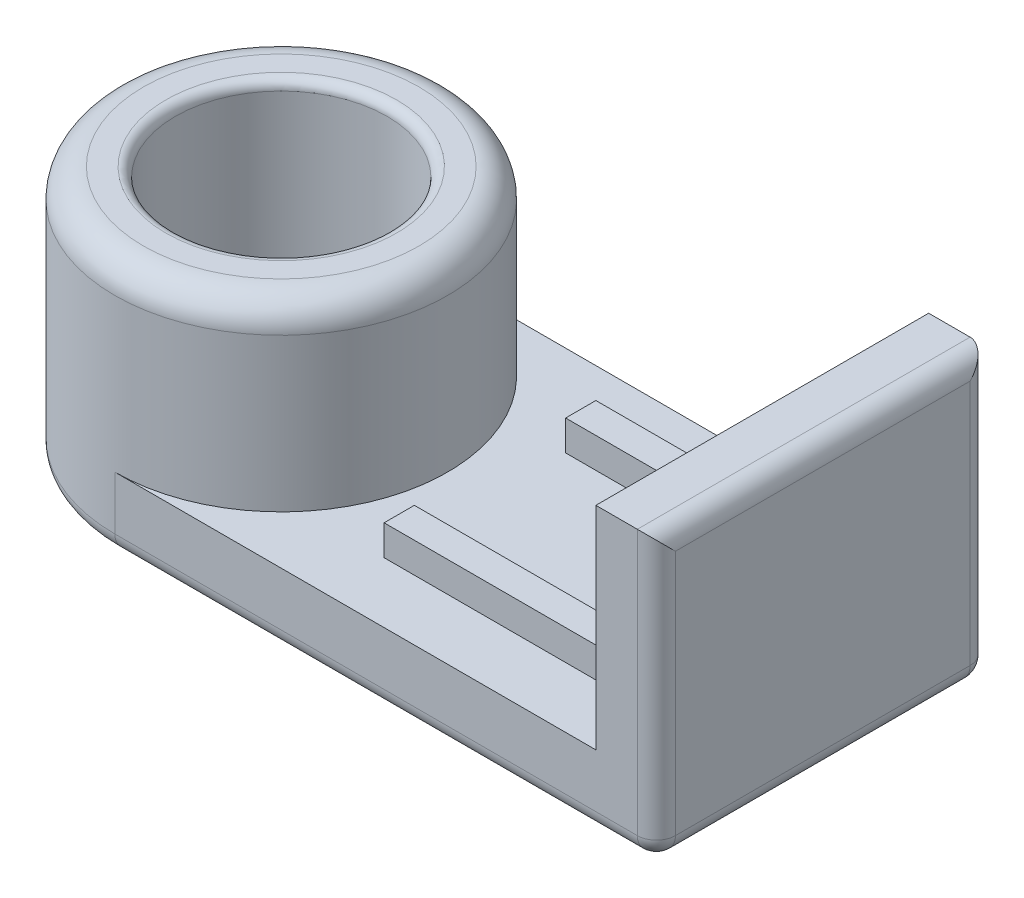
ISO-10303-21;
HEADER;
FILE_DESCRIPTION(('STEP AP214'),'2;1');
FILE_NAME('part.step','',(''),(''),'','','');
FILE_SCHEMA(('AUTOMOTIVE_DESIGN { 1 0 10303 214 1 1 1 1 }'));
ENDSEC;
DATA;
#1=APPLICATION_CONTEXT('core data for automotive mechanical design processes');
#2=APPLICATION_PROTOCOL_DEFINITION('international standard','automotive_design',2000,#1);
#3=PRODUCT_CONTEXT('',#1,'mechanical');
#4=PRODUCT('Part','Part','',(#3));
#5=PRODUCT_RELATED_PRODUCT_CATEGORY('part','',(#4));
#6=PRODUCT_DEFINITION_FORMATION('','',#4);
#7=PRODUCT_DEFINITION_CONTEXT('part definition',#1,'design');
#8=PRODUCT_DEFINITION('design','',#6,#7);
#9=PRODUCT_DEFINITION_SHAPE('','',#8);
#10=(LENGTH_UNIT() NAMED_UNIT(*) SI_UNIT(.MILLI.,.METRE.));
#11=(NAMED_UNIT(*) PLANE_ANGLE_UNIT() SI_UNIT($,.RADIAN.));
#12=(NAMED_UNIT(*) SI_UNIT($,.STERADIAN.) SOLID_ANGLE_UNIT());
#13=UNCERTAINTY_MEASURE_WITH_UNIT(LENGTH_MEASURE(1.E-05),#10,'distance_accuracy_value','');
#14=(GEOMETRIC_REPRESENTATION_CONTEXT(3) GLOBAL_UNCERTAINTY_ASSIGNED_CONTEXT((#13)) GLOBAL_UNIT_ASSIGNED_CONTEXT((#10,
#11,#12)) REPRESENTATION_CONTEXT('',''));
#15=CARTESIAN_POINT('',(0.,0.,0.));
#16=DIRECTION('',(0.,0.,1.));
#17=DIRECTION('',(1.,0.,0.));
#18=AXIS2_PLACEMENT_3D('',#15,#16,#17);
#19=CARTESIAN_POINT('',(-19.685,7.62,0.));
#20=DIRECTION('',(0.,1.,0.));
#21=DIRECTION('',(0.,0.,1.));
#22=AXIS2_PLACEMENT_3D('',#19,#20,#21);
#23=PLANE('',#22);
#24=DIRECTION('',(-1.,0.,0.));
#25=VECTOR('',#24,1.);
#26=CARTESIAN_POINT('',(27.6225,7.62,7.9375));
#27=LINE('',#26,#25);
#28=CARTESIAN_POINT('',(27.6225,7.62,7.9375));
#29=VERTEX_POINT('',#28);
#30=CARTESIAN_POINT('',(2.22249999999999,7.62,7.9375));
#31=VERTEX_POINT('',#30);
#32=EDGE_CURVE('E208',#29,#31,#27,.T.);
#33=ORIENTED_EDGE('',*,*,#32,.F.);
#34=DIRECTION('',(0.,0.,-1.));
#35=VECTOR('',#34,1.);
#36=CARTESIAN_POINT('',(27.6225,7.62,11.1125));
#37=LINE('',#36,#35);
#38=CARTESIAN_POINT('',(27.6225,7.62,11.1125));
#39=VERTEX_POINT('',#38);
#40=EDGE_CURVE('E194',#39,#29,#37,.T.);
#41=ORIENTED_EDGE('',*,*,#40,.F.);
#42=DIRECTION('',(1.,0.,0.));
#43=VECTOR('',#42,1.);
#44=CARTESIAN_POINT('',(27.6225,7.62,11.1125));
#45=LINE('',#44,#43);
#46=CARTESIAN_POINT('',(2.22249999999999,7.62,11.1125));
#47=VERTEX_POINT('',#46);
#48=EDGE_CURVE('E199',#47,#39,#45,.T.);
#49=ORIENTED_EDGE('',*,*,#48,.F.);
#50=DIRECTION('',(0.,0.,1.));
#51=VECTOR('',#50,1.);
#52=CARTESIAN_POINT('',(2.22249999999999,7.62,11.1125));
#53=LINE('',#52,#51);
#54=EDGE_CURVE('E210',#31,#47,#53,.T.);
#55=ORIENTED_EDGE('',*,*,#54,.F.);
#56=EDGE_LOOP('',(#33,#41,#49,#55));
#57=FACE_BOUND('',#56,.T.);
#58=DIRECTION('',(-1.,0.,0.));
#59=VECTOR('',#58,1.);
#60=CARTESIAN_POINT('',(27.6225,7.62,-11.1125));
#61=LINE('',#60,#59);
#62=CARTESIAN_POINT('',(27.6225,7.62,-11.1125));
#63=VERTEX_POINT('',#62);
#64=CARTESIAN_POINT('',(2.22249999999998,7.62,-11.1125));
#65=VERTEX_POINT('',#64);
#66=EDGE_CURVE('E237',#63,#65,#61,.T.);
#67=ORIENTED_EDGE('',*,*,#66,.F.);
#68=DIRECTION('',(0.,0.,-1.));
#69=VECTOR('',#68,1.);
#70=CARTESIAN_POINT('',(27.6225,7.62,-11.1125));
#71=LINE('',#70,#69);
#72=CARTESIAN_POINT('',(27.6225,7.62,-7.9375));
#73=VERTEX_POINT('',#72);
#74=EDGE_CURVE('E223',#73,#63,#71,.T.);
#75=ORIENTED_EDGE('',*,*,#74,.F.);
#76=DIRECTION('',(1.,0.,0.));
#77=VECTOR('',#76,1.);
#78=CARTESIAN_POINT('',(27.6225,7.62,-7.9375));
#79=LINE('',#78,#77);
#80=CARTESIAN_POINT('',(2.22249999999999,7.62,-7.9375));
#81=VERTEX_POINT('',#80);
#82=EDGE_CURVE('E228',#81,#73,#79,.T.);
#83=ORIENTED_EDGE('',*,*,#82,.F.);
#84=DIRECTION('',(0.,0.,1.));
#85=VECTOR('',#84,1.);
#86=CARTESIAN_POINT('',(2.22249999999998,7.62,-11.1125));
#87=LINE('',#86,#85);
#88=EDGE_CURVE('E239',#65,#81,#87,.T.);
#89=ORIENTED_EDGE('',*,*,#88,.F.);
#90=EDGE_LOOP('',(#67,#75,#83,#89));
#91=FACE_BOUND('',#90,.T.);
#92=DIRECTION('',(-1.,0.,0.));
#93=VECTOR('',#92,1.);
#94=CARTESIAN_POINT('',(-19.685,7.62,-17.4625));
#95=LINE('',#94,#93);
#96=CARTESIAN_POINT('',(30.7975,7.62,-17.4625));
#97=VERTEX_POINT('',#96);
#98=CARTESIAN_POINT('',(-19.685,7.62,-17.4625));
#99=VERTEX_POINT('',#98);
#100=EDGE_CURVE('E170',#97,#99,#95,.T.);
#101=ORIENTED_EDGE('',*,*,#100,.T.);
#102=CARTESIAN_POINT('',(-19.685,7.62,0.));
#103=DIRECTION('',(0.,1.,0.));
#104=DIRECTION('',(0.,0.,1.));
#105=AXIS2_PLACEMENT_3D('',#102,#103,#104);
#106=CIRCLE('',#105,17.4625);
#107=CARTESIAN_POINT('',(-19.685,7.62,17.4625));
#108=VERTEX_POINT('',#107);
#109=EDGE_CURVE('E175',#108,#99,#106,.T.);
#110=ORIENTED_EDGE('',*,*,#109,.F.);
#111=DIRECTION('',(1.,0.,0.));
#112=VECTOR('',#111,1.);
#113=CARTESIAN_POINT('',(-19.685,7.62,17.4625));
#114=LINE('',#113,#112);
#115=CARTESIAN_POINT('',(30.7975,7.62,17.4625));
#116=VERTEX_POINT('',#115);
#117=EDGE_CURVE('E161',#108,#116,#114,.T.);
#118=ORIENTED_EDGE('',*,*,#117,.T.);
#119=DIRECTION('',(0.,0.,1.));
#120=VECTOR('',#119,1.);
#121=CARTESIAN_POINT('',(30.7975,7.62,-17.4625));
#122=LINE('',#121,#120);
#123=EDGE_CURVE('E252',#97,#116,#122,.T.);
#124=ORIENTED_EDGE('',*,*,#123,.F.);
#125=EDGE_LOOP('',(#101,#110,#118,#124));
#126=FACE_BOUND('',#125,.T.);
#127=ADVANCED_FACE('F34',(#57,#91,#126),#23,.T.);
#128=CARTESIAN_POINT('',(-19.685,7.62,17.4625));
#129=DIRECTION('',(0.,0.,-1.));
#130=DIRECTION('',(-1.,0.,0.));
#131=AXIS2_PLACEMENT_3D('',#128,#129,#130);
#132=PLANE('',#131);
#133=DIRECTION('',(0.,-1.,0.));
#134=VECTOR('',#133,1.);
#135=CARTESIAN_POINT('',(-19.685,7.62,17.4625));
#136=LINE('',#135,#134);
#137=CARTESIAN_POINT('',(-19.685,2.,17.4625));
#138=VERTEX_POINT('',#137);
#139=EDGE_CURVE('E163',#108,#138,#136,.T.);
#140=ORIENTED_EDGE('',*,*,#139,.T.);
#141=DIRECTION('',(1.,0.,0.));
#142=VECTOR('',#141,1.);
#143=CARTESIAN_POINT('',(-19.685,2.,17.4625));
#144=LINE('',#143,#142);
#145=CARTESIAN_POINT('',(35.1475,2.,17.4625));
#146=VERTEX_POINT('',#145);
#147=EDGE_CURVE('E302',#138,#146,#144,.T.);
#148=ORIENTED_EDGE('',*,*,#147,.T.);
#149=DIRECTION('',(0.,-1.,0.));
#150=VECTOR('',#149,1.);
#151=CARTESIAN_POINT('',(35.1475,7.62,17.4625));
#152=LINE('',#151,#150);
#153=CARTESIAN_POINT('',(35.1475,29.845,17.4625));
#154=VERTEX_POINT('',#153);
#155=EDGE_CURVE('E274',#146,#154,#152,.F.);
#156=ORIENTED_EDGE('',*,*,#155,.T.);
#157=DIRECTION('',(1.,0.,0.));
#158=VECTOR('',#157,1.);
#159=CARTESIAN_POINT('',(30.7975,29.845,17.4625));
#160=LINE('',#159,#158);
#161=CARTESIAN_POINT('',(30.7975,29.845,17.4625));
#162=VERTEX_POINT('',#161);
#163=EDGE_CURVE('E188',#162,#154,#160,.T.);
#164=ORIENTED_EDGE('',*,*,#163,.F.);
#165=DIRECTION('',(0.,-1.,0.));
#166=VECTOR('',#165,1.);
#167=CARTESIAN_POINT('',(30.7975,20.32,17.4625));
#168=LINE('',#167,#166);
#169=EDGE_CURVE('E166',#162,#116,#168,.T.);
#170=ORIENTED_EDGE('',*,*,#169,.T.);
#171=ORIENTED_EDGE('',*,*,#117,.F.);
#172=EDGE_LOOP('',(#140,#148,#156,#164,#170,#171));
#173=FACE_BOUND('',#172,.T.);
#174=ADVANCED_FACE('F162',(#173),#132,.F.);
#175=CARTESIAN_POINT('',(37.1475,7.62,17.4625));
#176=DIRECTION('',(-1.,0.,0.));
#177=DIRECTION('',(0.,0.,1.));
#178=AXIS2_PLACEMENT_3D('',#175,#176,#177);
#179=PLANE('',#178);
#180=DIRECTION('',(0.,-1.,0.));
#181=VECTOR('',#180,1.);
#182=CARTESIAN_POINT('',(37.1475,7.62,15.4625));
#183=LINE('',#182,#181);
#184=CARTESIAN_POINT('',(37.1475,27.845,15.4625));
#185=VERTEX_POINT('',#184);
#186=CARTESIAN_POINT('',(37.1475,2.,15.4625));
#187=VERTEX_POINT('',#186);
#188=EDGE_CURVE('E271',#185,#187,#183,.T.);
#189=ORIENTED_EDGE('',*,*,#188,.T.);
#190=DIRECTION('',(0.,0.,-1.));
#191=VECTOR('',#190,1.);
#192=CARTESIAN_POINT('',(37.1475,2.,17.4625));
#193=LINE('',#192,#191);
#194=CARTESIAN_POINT('',(37.1475,2.,-15.4625));
#195=VERTEX_POINT('',#194);
#196=EDGE_CURVE('E289',#187,#195,#193,.T.);
#197=ORIENTED_EDGE('',*,*,#196,.T.);
#198=DIRECTION('',(0.,-1.,0.));
#199=VECTOR('',#198,1.);
#200=CARTESIAN_POINT('',(37.1475,7.62,-15.4625));
#201=LINE('',#200,#199);
#202=CARTESIAN_POINT('',(37.1475,27.845,-15.4625));
#203=VERTEX_POINT('',#202);
#204=EDGE_CURVE('E269',#195,#203,#201,.F.);
#205=ORIENTED_EDGE('',*,*,#204,.T.);
#206=DIRECTION('',(0.,0.,-1.));
#207=VECTOR('',#206,1.);
#208=CARTESIAN_POINT('',(37.1475,27.845,17.4625));
#209=LINE('',#208,#207);
#210=EDGE_CURVE('E267',#203,#185,#209,.F.);
#211=ORIENTED_EDGE('',*,*,#210,.T.);
#212=EDGE_LOOP('',(#189,#197,#205,#211));
#213=FACE_BOUND('',#212,.T.);
#214=ADVANCED_FACE('F349',(#213),#179,.F.);
#215=CARTESIAN_POINT('',(-19.685,7.62,-17.4625));
#216=DIRECTION('',(0.,0.,1.));
#217=DIRECTION('',(1.,0.,0.));
#218=AXIS2_PLACEMENT_3D('',#215,#216,#217);
#219=PLANE('',#218);
#220=DIRECTION('',(0.,-1.,0.));
#221=VECTOR('',#220,1.);
#222=CARTESIAN_POINT('',(35.1475,7.62,-17.4625));
#223=LINE('',#222,#221);
#224=CARTESIAN_POINT('',(35.1475,29.845,-17.4625));
#225=VERTEX_POINT('',#224);
#226=CARTESIAN_POINT('',(35.1475,2.,-17.4625));
#227=VERTEX_POINT('',#226);
#228=EDGE_CURVE('E276',#225,#227,#223,.T.);
#229=ORIENTED_EDGE('',*,*,#228,.T.);
#230=DIRECTION('',(-1.,0.,0.));
#231=VECTOR('',#230,1.);
#232=CARTESIAN_POINT('',(-19.685,2.,-17.4625));
#233=LINE('',#232,#231);
#234=CARTESIAN_POINT('',(-19.685,2.,-17.4625));
#235=VERTEX_POINT('',#234);
#236=EDGE_CURVE('E49',#227,#235,#233,.T.);
#237=ORIENTED_EDGE('',*,*,#236,.T.);
#238=DIRECTION('',(0.,-1.,0.));
#239=VECTOR('',#238,1.);
#240=CARTESIAN_POINT('',(-19.685,7.62,-17.4625));
#241=LINE('',#240,#239);
#242=EDGE_CURVE('E176',#99,#235,#241,.T.);
#243=ORIENTED_EDGE('',*,*,#242,.F.);
#244=ORIENTED_EDGE('',*,*,#100,.F.);
#245=DIRECTION('',(0.,-1.,0.));
#246=VECTOR('',#245,1.);
#247=CARTESIAN_POINT('',(30.7975,20.32,-17.4625));
#248=LINE('',#247,#246);
#249=CARTESIAN_POINT('',(30.7975,29.845,-17.4625));
#250=VERTEX_POINT('',#249);
#251=EDGE_CURVE('E171',#250,#97,#248,.T.);
#252=ORIENTED_EDGE('',*,*,#251,.F.);
#253=DIRECTION('',(-1.,0.,0.));
#254=VECTOR('',#253,1.);
#255=CARTESIAN_POINT('',(30.7975,29.845,-17.4625));
#256=LINE('',#255,#254);
#257=EDGE_CURVE('E192',#225,#250,#256,.T.);
#258=ORIENTED_EDGE('',*,*,#257,.F.);
#259=EDGE_LOOP('',(#229,#237,#243,#244,#252,#258));
#260=FACE_BOUND('',#259,.T.);
#261=ADVANCED_FACE('F363',(#260),#219,.F.);
#262=CARTESIAN_POINT('',(-19.685,7.62,0.));
#263=DIRECTION('',(0.,-1.,0.));
#264=DIRECTION('',(0.,0.,-1.));
#265=AXIS2_PLACEMENT_3D('',#262,#263,#264);
#266=CYLINDRICAL_SURFACE('',#265,17.4625);
#267=CARTESIAN_POINT('',(-19.685,23.67,0.));
#268=DIRECTION('',(0.,1.,0.));
#269=DIRECTION('',(0.,0.,1.));
#270=AXIS2_PLACEMENT_3D('',#267,#268,#269);
#271=CIRCLE('',#270,17.4625);
#272=CARTESIAN_POINT('',(-19.685,23.67,17.4625));
#273=VERTEX_POINT('',#272);
#274=EDGE_CURVE('E11',#273,#273,#271,.F.);
#275=ORIENTED_EDGE('',*,*,#274,.T.);
#276=EDGE_LOOP('',(#275));
#277=FACE_BOUND('',#276,.T.);
#278=ORIENTED_EDGE('',*,*,#242,.T.);
#279=CARTESIAN_POINT('',(-19.685,2.,0.));
#280=DIRECTION('',(0.,1.,0.));
#281=DIRECTION('',(0.,0.,1.));
#282=AXIS2_PLACEMENT_3D('',#279,#280,#281);
#283=CIRCLE('',#282,17.4625);
#284=EDGE_CURVE('E56',#235,#138,#283,.T.);
#285=ORIENTED_EDGE('',*,*,#284,.T.);
#286=ORIENTED_EDGE('',*,*,#139,.F.);
#287=ORIENTED_EDGE('',*,*,#109,.T.);
#288=EDGE_LOOP('',(#278,#285,#286,#287));
#289=FACE_BOUND('',#288,.T.);
#290=ADVANCED_FACE('F174',(#277,#289),#266,.T.);
#291=CARTESIAN_POINT('',(-19.685,0.,0.));
#292=DIRECTION('',(0.,1.,0.));
#293=DIRECTION('',(0.,0.,1.));
#294=AXIS2_PLACEMENT_3D('',#291,#292,#293);
#295=PLANE('',#294);
#296=CARTESIAN_POINT('',(-19.685,0.,0.));
#297=DIRECTION('',(0.,1.,0.));
#298=DIRECTION('',(0.,0.,1.));
#299=AXIS2_PLACEMENT_3D('',#296,#297,#298);
#300=CIRCLE('',#299,12.1125);
#301=CARTESIAN_POINT('',(-19.685,0.,12.1125));
#302=VERTEX_POINT('',#301);
#303=EDGE_CURVE('E326',#302,#302,#300,.T.);
#304=ORIENTED_EDGE('',*,*,#303,.T.);
#305=EDGE_LOOP('',(#304));
#306=FACE_BOUND('',#305,.T.);
#307=DIRECTION('',(-1.,0.,0.));
#308=VECTOR('',#307,1.);
#309=CARTESIAN_POINT('',(-19.685,0.,-15.4625));
#310=LINE('',#309,#308);
#311=CARTESIAN_POINT('',(-19.685,0.,-15.4625));
#312=VERTEX_POINT('',#311);
#313=CARTESIAN_POINT('',(35.1475,0.,-15.4625));
#314=VERTEX_POINT('',#313);
#315=EDGE_CURVE('E291',#312,#314,#310,.F.);
#316=ORIENTED_EDGE('',*,*,#315,.T.);
#317=DIRECTION('',(0.,0.,-1.));
#318=VECTOR('',#317,1.);
#319=CARTESIAN_POINT('',(35.1475,0.,0.));
#320=LINE('',#319,#318);
#321=CARTESIAN_POINT('',(35.1475,0.,15.4625));
#322=VERTEX_POINT('',#321);
#323=EDGE_CURVE('E297',#314,#322,#320,.F.);
#324=ORIENTED_EDGE('',*,*,#323,.T.);
#325=DIRECTION('',(1.,0.,0.));
#326=VECTOR('',#325,1.);
#327=CARTESIAN_POINT('',(-19.685,0.,15.4625));
#328=LINE('',#327,#326);
#329=CARTESIAN_POINT('',(-19.685,0.,15.4625));
#330=VERTEX_POINT('',#329);
#331=EDGE_CURVE('E295',#322,#330,#328,.F.);
#332=ORIENTED_EDGE('',*,*,#331,.T.);
#333=CARTESIAN_POINT('',(-19.685,0.,0.));
#334=DIRECTION('',(0.,1.,0.));
#335=DIRECTION('',(0.,0.,1.));
#336=AXIS2_PLACEMENT_3D('',#333,#334,#335);
#337=CIRCLE('',#336,15.4625);
#338=EDGE_CURVE('E293',#330,#312,#337,.F.);
#339=ORIENTED_EDGE('',*,*,#338,.T.);
#340=EDGE_LOOP('',(#316,#324,#332,#339));
#341=FACE_BOUND('',#340,.T.);
#342=ADVANCED_FACE('F357',(#306,#341),#295,.F.);
#343=CARTESIAN_POINT('',(30.7975,20.32,-17.4625));
#344=DIRECTION('',(1.,0.,0.));
#345=DIRECTION('',(0.,0.,-1.));
#346=AXIS2_PLACEMENT_3D('',#343,#344,#345);
#347=PLANE('',#346);
#348=ORIENTED_EDGE('',*,*,#123,.T.);
#349=ORIENTED_EDGE('',*,*,#169,.F.);
#350=DIRECTION('',(0.,0.,1.));
#351=VECTOR('',#350,1.);
#352=CARTESIAN_POINT('',(30.7975,29.845,-17.4625));
#353=LINE('',#352,#351);
#354=EDGE_CURVE('E185',#250,#162,#353,.T.);
#355=ORIENTED_EDGE('',*,*,#354,.F.);
#356=ORIENTED_EDGE('',*,*,#251,.T.);
#357=EDGE_LOOP('',(#348,#349,#355,#356));
#358=FACE_BOUND('',#357,.T.);
#359=ADVANCED_FACE('F355',(#358),#347,.F.);
#360=CARTESIAN_POINT('',(-19.685,-5.08,0.));
#361=DIRECTION('',(0.,1.,0.));
#362=DIRECTION('',(0.,0.,1.));
#363=AXIS2_PLACEMENT_3D('',#360,#361,#362);
#364=CYLINDRICAL_SURFACE('',#363,11.1125);
#365=CARTESIAN_POINT('',(-19.685,25.67,0.));
#366=DIRECTION('',(0.,1.,0.));
#367=DIRECTION('',(0.,0.,1.));
#368=AXIS2_PLACEMENT_3D('',#365,#366,#367);
#369=CIRCLE('',#368,11.1125);
#370=CARTESIAN_POINT('',(-19.685,25.67,11.1125));
#371=VERTEX_POINT('',#370);
#372=EDGE_CURVE('E320',#371,#371,#369,.T.);
#373=ORIENTED_EDGE('',*,*,#372,.T.);
#374=EDGE_LOOP('',(#373));
#375=FACE_BOUND('',#374,.T.);
#376=CARTESIAN_POINT('',(-19.685,1.,0.));
#377=DIRECTION('',(0.,1.,0.));
#378=DIRECTION('',(0.,0.,1.));
#379=AXIS2_PLACEMENT_3D('',#376,#377,#378);
#380=CIRCLE('',#379,11.1125);
#381=CARTESIAN_POINT('',(-19.685,1.,11.1125));
#382=VERTEX_POINT('',#381);
#383=EDGE_CURVE('E305',#382,#382,#380,.F.);
#384=ORIENTED_EDGE('',*,*,#383,.T.);
#385=EDGE_LOOP('',(#384));
#386=FACE_BOUND('',#385,.T.);
#387=ADVANCED_FACE('F417',(#375,#386),#364,.F.);
#388=CARTESIAN_POINT('',(27.6225,10.795,-11.1125));
#389=DIRECTION('',(-1.,0.,0.));
#390=DIRECTION('',(0.,0.,1.));
#391=AXIS2_PLACEMENT_3D('',#388,#389,#390);
#392=PLANE('',#391);
#393=ORIENTED_EDGE('',*,*,#74,.T.);
#394=DIRECTION('',(0.,-1.,0.));
#395=VECTOR('',#394,1.);
#396=CARTESIAN_POINT('',(27.6225,10.795,-11.1125));
#397=LINE('',#396,#395);
#398=CARTESIAN_POINT('',(27.6225,10.795,-11.1125));
#399=VERTEX_POINT('',#398);
#400=EDGE_CURVE('E250',#399,#63,#397,.T.);
#401=ORIENTED_EDGE('',*,*,#400,.F.);
#402=DIRECTION('',(0.,0.,-1.));
#403=VECTOR('',#402,1.);
#404=CARTESIAN_POINT('',(27.6225,10.795,-11.1125));
#405=LINE('',#404,#403);
#406=CARTESIAN_POINT('',(27.6225,10.795,-7.9375));
#407=VERTEX_POINT('',#406);
#408=EDGE_CURVE('E224',#407,#399,#405,.T.);
#409=ORIENTED_EDGE('',*,*,#408,.F.);
#410=DIRECTION('',(0.,-1.,0.));
#411=VECTOR('',#410,1.);
#412=CARTESIAN_POINT('',(27.6225,10.795,-7.9375));
#413=LINE('',#412,#411);
#414=EDGE_CURVE('E234',#407,#73,#413,.T.);
#415=ORIENTED_EDGE('',*,*,#414,.T.);
#416=EDGE_LOOP('',(#393,#401,#409,#415));
#417=FACE_BOUND('',#416,.T.);
#418=ADVANCED_FACE('F420',(#417),#392,.F.);
#419=CARTESIAN_POINT('',(27.6225,10.795,-11.1125));
#420=DIRECTION('',(0.,0.,1.));
#421=DIRECTION('',(1.,0.,0.));
#422=AXIS2_PLACEMENT_3D('',#419,#420,#421);
#423=PLANE('',#422);
#424=ORIENTED_EDGE('',*,*,#66,.T.);
#425=DIRECTION('',(0.,-1.,0.));
#426=VECTOR('',#425,1.);
#427=CARTESIAN_POINT('',(2.22249999999998,10.795,-11.1125));
#428=LINE('',#427,#426);
#429=CARTESIAN_POINT('',(2.22249999999998,10.795,-11.1125));
#430=VERTEX_POINT('',#429);
#431=EDGE_CURVE('E247',#430,#65,#428,.T.);
#432=ORIENTED_EDGE('',*,*,#431,.F.);
#433=DIRECTION('',(-1.,0.,0.));
#434=VECTOR('',#433,1.);
#435=CARTESIAN_POINT('',(27.6225,10.795,-11.1125));
#436=LINE('',#435,#434);
#437=EDGE_CURVE('E227',#399,#430,#436,.T.);
#438=ORIENTED_EDGE('',*,*,#437,.F.);
#439=ORIENTED_EDGE('',*,*,#400,.T.);
#440=EDGE_LOOP('',(#424,#432,#438,#439));
#441=FACE_BOUND('',#440,.T.);
#442=ADVANCED_FACE('F470',(#441),#423,.F.);
#443=CARTESIAN_POINT('',(2.22249999999998,10.795,-11.1125));
#444=DIRECTION('',(1.,0.,0.));
#445=DIRECTION('',(0.,0.,-1.));
#446=AXIS2_PLACEMENT_3D('',#443,#444,#445);
#447=PLANE('',#446);
#448=ORIENTED_EDGE('',*,*,#88,.T.);
#449=DIRECTION('',(0.,-1.,0.));
#450=VECTOR('',#449,1.);
#451=CARTESIAN_POINT('',(2.22249999999999,10.795,-7.9375));
#452=LINE('',#451,#450);
#453=CARTESIAN_POINT('',(2.22249999999999,10.795,-7.9375));
#454=VERTEX_POINT('',#453);
#455=EDGE_CURVE('E245',#454,#81,#452,.T.);
#456=ORIENTED_EDGE('',*,*,#455,.F.);
#457=DIRECTION('',(0.,0.,1.));
#458=VECTOR('',#457,1.);
#459=CARTESIAN_POINT('',(2.22249999999998,10.795,-11.1125));
#460=LINE('',#459,#458);
#461=EDGE_CURVE('E230',#430,#454,#460,.T.);
#462=ORIENTED_EDGE('',*,*,#461,.F.);
#463=ORIENTED_EDGE('',*,*,#431,.T.);
#464=EDGE_LOOP('',(#448,#456,#462,#463));
#465=FACE_BOUND('',#464,.T.);
#466=ADVANCED_FACE('F478',(#465),#447,.F.);
#467=CARTESIAN_POINT('',(27.6225,10.795,-7.9375));
#468=DIRECTION('',(0.,0.,-1.));
#469=DIRECTION('',(-1.,0.,0.));
#470=AXIS2_PLACEMENT_3D('',#467,#468,#469);
#471=PLANE('',#470);
#472=ORIENTED_EDGE('',*,*,#82,.T.);
#473=ORIENTED_EDGE('',*,*,#414,.F.);
#474=DIRECTION('',(1.,0.,0.));
#475=VECTOR('',#474,1.);
#476=CARTESIAN_POINT('',(27.6225,10.795,-7.9375));
#477=LINE('',#476,#475);
#478=EDGE_CURVE('E232',#454,#407,#477,.T.);
#479=ORIENTED_EDGE('',*,*,#478,.F.);
#480=ORIENTED_EDGE('',*,*,#455,.T.);
#481=EDGE_LOOP('',(#472,#473,#479,#480));
#482=FACE_BOUND('',#481,.T.);
#483=ADVANCED_FACE('F486',(#482),#471,.F.);
#484=CARTESIAN_POINT('',(0.,10.795,0.));
#485=DIRECTION('',(0.,-1.,0.));
#486=DIRECTION('',(0.,0.,-1.));
#487=AXIS2_PLACEMENT_3D('',#484,#485,#486);
#488=PLANE('',#487);
#489=ORIENTED_EDGE('',*,*,#408,.T.);
#490=ORIENTED_EDGE('',*,*,#437,.T.);
#491=ORIENTED_EDGE('',*,*,#461,.T.);
#492=ORIENTED_EDGE('',*,*,#478,.T.);
#493=EDGE_LOOP('',(#489,#490,#491,#492));
#494=FACE_BOUND('',#493,.T.);
#495=ADVANCED_FACE('F494',(#494),#488,.F.);
#496=CARTESIAN_POINT('',(27.6225,10.795,11.1125));
#497=DIRECTION('',(-1.,0.,0.));
#498=DIRECTION('',(0.,0.,1.));
#499=AXIS2_PLACEMENT_3D('',#496,#497,#498);
#500=PLANE('',#499);
#501=ORIENTED_EDGE('',*,*,#40,.T.);
#502=DIRECTION('',(0.,-1.,0.));
#503=VECTOR('',#502,1.);
#504=CARTESIAN_POINT('',(27.6225,10.795,7.9375));
#505=LINE('',#504,#503);
#506=CARTESIAN_POINT('',(27.6225,10.795,7.9375));
#507=VERTEX_POINT('',#506);
#508=EDGE_CURVE('E221',#507,#29,#505,.T.);
#509=ORIENTED_EDGE('',*,*,#508,.F.);
#510=DIRECTION('',(0.,0.,-1.));
#511=VECTOR('',#510,1.);
#512=CARTESIAN_POINT('',(27.6225,10.795,11.1125));
#513=LINE('',#512,#511);
#514=CARTESIAN_POINT('',(27.6225,10.795,11.1125));
#515=VERTEX_POINT('',#514);
#516=EDGE_CURVE('E195',#515,#507,#513,.T.);
#517=ORIENTED_EDGE('',*,*,#516,.F.);
#518=DIRECTION('',(0.,-1.,0.));
#519=VECTOR('',#518,1.);
#520=CARTESIAN_POINT('',(27.6225,10.795,11.1125));
#521=LINE('',#520,#519);
#522=EDGE_CURVE('E205',#515,#39,#521,.T.);
#523=ORIENTED_EDGE('',*,*,#522,.T.);
#524=EDGE_LOOP('',(#501,#509,#517,#523));
#525=FACE_BOUND('',#524,.T.);
#526=ADVANCED_FACE('F502',(#525),#500,.F.);
#527=CARTESIAN_POINT('',(27.6225,10.795,7.9375));
#528=DIRECTION('',(0.,0.,1.));
#529=DIRECTION('',(1.,0.,0.));
#530=AXIS2_PLACEMENT_3D('',#527,#528,#529);
#531=PLANE('',#530);
#532=ORIENTED_EDGE('',*,*,#32,.T.);
#533=DIRECTION('',(0.,-1.,0.));
#534=VECTOR('',#533,1.);
#535=CARTESIAN_POINT('',(2.22249999999999,10.795,7.9375));
#536=LINE('',#535,#534);
#537=CARTESIAN_POINT('',(2.22249999999999,10.795,7.9375));
#538=VERTEX_POINT('',#537);
#539=EDGE_CURVE('E218',#538,#31,#536,.T.);
#540=ORIENTED_EDGE('',*,*,#539,.F.);
#541=DIRECTION('',(-1.,0.,0.));
#542=VECTOR('',#541,1.);
#543=CARTESIAN_POINT('',(27.6225,10.795,7.9375));
#544=LINE('',#543,#542);
#545=EDGE_CURVE('E198',#507,#538,#544,.T.);
#546=ORIENTED_EDGE('',*,*,#545,.F.);
#547=ORIENTED_EDGE('',*,*,#508,.T.);
#548=EDGE_LOOP('',(#532,#540,#546,#547));
#549=FACE_BOUND('',#548,.T.);
#550=ADVANCED_FACE('F510',(#549),#531,.F.);
#551=CARTESIAN_POINT('',(2.22249999999999,10.795,11.1125));
#552=DIRECTION('',(1.,0.,0.));
#553=DIRECTION('',(0.,0.,-1.));
#554=AXIS2_PLACEMENT_3D('',#551,#552,#553);
#555=PLANE('',#554);
#556=ORIENTED_EDGE('',*,*,#54,.T.);
#557=DIRECTION('',(0.,-1.,0.));
#558=VECTOR('',#557,1.);
#559=CARTESIAN_POINT('',(2.22249999999999,10.795,11.1125));
#560=LINE('',#559,#558);
#561=CARTESIAN_POINT('',(2.22249999999999,10.795,11.1125));
#562=VERTEX_POINT('',#561);
#563=EDGE_CURVE('E216',#562,#47,#560,.T.);
#564=ORIENTED_EDGE('',*,*,#563,.F.);
#565=DIRECTION('',(0.,0.,1.));
#566=VECTOR('',#565,1.);
#567=CARTESIAN_POINT('',(2.22249999999999,10.795,11.1125));
#568=LINE('',#567,#566);
#569=EDGE_CURVE('E201',#538,#562,#568,.T.);
#570=ORIENTED_EDGE('',*,*,#569,.F.);
#571=ORIENTED_EDGE('',*,*,#539,.T.);
#572=EDGE_LOOP('',(#556,#564,#570,#571));
#573=FACE_BOUND('',#572,.T.);
#574=ADVANCED_FACE('F518',(#573),#555,.F.);
#575=CARTESIAN_POINT('',(27.6225,10.795,11.1125));
#576=DIRECTION('',(0.,0.,-1.));
#577=DIRECTION('',(-1.,0.,0.));
#578=AXIS2_PLACEMENT_3D('',#575,#576,#577);
#579=PLANE('',#578);
#580=ORIENTED_EDGE('',*,*,#48,.T.);
#581=ORIENTED_EDGE('',*,*,#522,.F.);
#582=DIRECTION('',(1.,0.,0.));
#583=VECTOR('',#582,1.);
#584=CARTESIAN_POINT('',(27.6225,10.795,11.1125));
#585=LINE('',#584,#583);
#586=EDGE_CURVE('E203',#562,#515,#585,.T.);
#587=ORIENTED_EDGE('',*,*,#586,.F.);
#588=ORIENTED_EDGE('',*,*,#563,.T.);
#589=EDGE_LOOP('',(#580,#581,#587,#588));
#590=FACE_BOUND('',#589,.T.);
#591=ADVANCED_FACE('F526',(#590),#579,.F.);
#592=CARTESIAN_POINT('',(0.,10.795,0.));
#593=DIRECTION('',(0.,1.,0.));
#594=DIRECTION('',(0.,0.,1.));
#595=AXIS2_PLACEMENT_3D('',#592,#593,#594);
#596=PLANE('',#595);
#597=ORIENTED_EDGE('',*,*,#516,.T.);
#598=ORIENTED_EDGE('',*,*,#545,.T.);
#599=ORIENTED_EDGE('',*,*,#569,.T.);
#600=ORIENTED_EDGE('',*,*,#586,.T.);
#601=EDGE_LOOP('',(#597,#598,#599,#600));
#602=FACE_BOUND('',#601,.T.);
#603=ADVANCED_FACE('F534',(#602),#596,.T.);
#604=CARTESIAN_POINT('',(0.,29.845,0.));
#605=DIRECTION('',(0.,1.,0.));
#606=DIRECTION('',(0.,0.,1.));
#607=AXIS2_PLACEMENT_3D('',#604,#605,#606);
#608=PLANE('',#607);
#609=ORIENTED_EDGE('',*,*,#163,.T.);
#610=DIRECTION('',(0.,0.,-1.));
#611=VECTOR('',#610,1.);
#612=CARTESIAN_POINT('',(35.1475,29.845,-17.4625));
#613=LINE('',#612,#611);
#614=EDGE_CURVE('E278',#154,#225,#613,.T.);
#615=ORIENTED_EDGE('',*,*,#614,.T.);
#616=ORIENTED_EDGE('',*,*,#257,.T.);
#617=ORIENTED_EDGE('',*,*,#354,.T.);
#618=EDGE_LOOP('',(#609,#615,#616,#617));
#619=FACE_BOUND('',#618,.T.);
#620=ADVANCED_FACE('F382',(#619),#608,.T.);
#621=CARTESIAN_POINT('',(35.1475,7.62,-15.4625));
#622=DIRECTION('',(0.,-1.,0.));
#623=DIRECTION('',(0.,0.,-1.));
#624=AXIS2_PLACEMENT_3D('',#621,#622,#623);
#625=CYLINDRICAL_SURFACE('',#624,2.);
#626=ORIENTED_EDGE('',*,*,#204,.F.);
#627=CARTESIAN_POINT('',(35.1475,2.,-15.4625));
#628=DIRECTION('',(0.,-1.,0.));
#629=DIRECTION('',(0.,0.,-1.));
#630=AXIS2_PLACEMENT_3D('',#627,#628,#629);
#631=CIRCLE('',#630,2.);
#632=EDGE_CURVE('E280',#195,#227,#631,.F.);
#633=ORIENTED_EDGE('',*,*,#632,.T.);
#634=ORIENTED_EDGE('',*,*,#228,.F.);
#635=CARTESIAN_POINT('',(35.1475,27.845,-15.4625));
#636=DIRECTION('',(0.,0.707106781186547,0.707106781186547));
#637=DIRECTION('',(0.,-0.707106781186547,0.707106781186547));
#638=AXIS2_PLACEMENT_3D('',#635,#636,#637);
#639=ELLIPSE('',#638,2.82842712474619,2.);
#640=EDGE_CURVE('E189',#203,#225,#639,.T.);
#641=ORIENTED_EDGE('',*,*,#640,.F.);
#642=EDGE_LOOP('',(#626,#633,#634,#641));
#643=FACE_BOUND('',#642,.T.);
#644=ADVANCED_FACE('F378',(#643),#625,.T.);
#645=CARTESIAN_POINT('',(35.1475,27.845,0.));
#646=DIRECTION('',(0.,0.,1.));
#647=DIRECTION('',(1.,0.,0.));
#648=AXIS2_PLACEMENT_3D('',#645,#646,#647);
#649=CYLINDRICAL_SURFACE('',#648,2.);
#650=ORIENTED_EDGE('',*,*,#640,.T.);
#651=ORIENTED_EDGE('',*,*,#614,.F.);
#652=CARTESIAN_POINT('',(35.1475,27.845,15.4625));
#653=DIRECTION('',(0.,-0.707106781186547,0.707106781186547));
#654=DIRECTION('',(0.,0.707106781186547,0.707106781186547));
#655=AXIS2_PLACEMENT_3D('',#652,#653,#654);
#656=ELLIPSE('',#655,2.82842712474619,2.);
#657=EDGE_CURVE('E281',#185,#154,#656,.T.);
#658=ORIENTED_EDGE('',*,*,#657,.F.);
#659=ORIENTED_EDGE('',*,*,#210,.F.);
#660=EDGE_LOOP('',(#650,#651,#658,#659));
#661=FACE_BOUND('',#660,.T.);
#662=ADVANCED_FACE('F374',(#661),#649,.T.);
#663=CARTESIAN_POINT('',(35.1475,7.62,15.4625));
#664=DIRECTION('',(0.,-1.,0.));
#665=DIRECTION('',(0.,0.,-1.));
#666=AXIS2_PLACEMENT_3D('',#663,#664,#665);
#667=CYLINDRICAL_SURFACE('',#666,2.);
#668=ORIENTED_EDGE('',*,*,#155,.F.);
#669=CARTESIAN_POINT('',(35.1475,2.,15.4625));
#670=DIRECTION('',(0.,-1.,0.));
#671=DIRECTION('',(0.,0.,-1.));
#672=AXIS2_PLACEMENT_3D('',#669,#670,#671);
#673=CIRCLE('',#672,2.);
#674=EDGE_CURVE('E300',#146,#187,#673,.F.);
#675=ORIENTED_EDGE('',*,*,#674,.T.);
#676=ORIENTED_EDGE('',*,*,#188,.F.);
#677=ORIENTED_EDGE('',*,*,#657,.T.);
#678=EDGE_LOOP('',(#668,#675,#676,#677));
#679=FACE_BOUND('',#678,.T.);
#680=ADVANCED_FACE('F370',(#679),#667,.T.);
#681=CARTESIAN_POINT('',(-19.685,2.,15.4625));
#682=DIRECTION('',(1.,0.,0.));
#683=DIRECTION('',(0.,0.,-1.));
#684=AXIS2_PLACEMENT_3D('',#681,#682,#683);
#685=CYLINDRICAL_SURFACE('',#684,2.);
#686=CARTESIAN_POINT('',(35.1475,2.,15.4625));
#687=DIRECTION('',(1.,0.,0.));
#688=DIRECTION('',(0.,1.,0.));
#689=AXIS2_PLACEMENT_3D('',#686,#687,#688);
#690=CIRCLE('',#689,2.);
#691=EDGE_CURVE('E313',#146,#322,#690,.T.);
#692=ORIENTED_EDGE('',*,*,#691,.F.);
#693=ORIENTED_EDGE('',*,*,#147,.F.);
#694=CARTESIAN_POINT('',(-19.685,2.,15.4625));
#695=DIRECTION('',(-1.,0.,0.));
#696=DIRECTION('',(0.,0.,1.));
#697=AXIS2_PLACEMENT_3D('',#694,#695,#696);
#698=CIRCLE('',#697,2.);
#699=EDGE_CURVE('E284',#330,#138,#698,.T.);
#700=ORIENTED_EDGE('',*,*,#699,.F.);
#701=ORIENTED_EDGE('',*,*,#331,.F.);
#702=EDGE_LOOP('',(#692,#693,#700,#701));
#703=FACE_BOUND('',#702,.T.);
#704=ADVANCED_FACE('F373',(#703),#685,.T.);
#705=CARTESIAN_POINT('',(-19.685,2.,0.));
#706=DIRECTION('',(0.,1.,0.));
#707=DIRECTION('',(0.,0.,1.));
#708=AXIS2_PLACEMENT_3D('',#705,#706,#707);
#709=TOROIDAL_SURFACE('',#708,15.4625,2.);
#710=ORIENTED_EDGE('',*,*,#699,.T.);
#711=ORIENTED_EDGE('',*,*,#284,.F.);
#712=CARTESIAN_POINT('',(-19.685,2.,-15.4625));
#713=DIRECTION('',(1.,0.,0.));
#714=DIRECTION('',(0.,0.,-1.));
#715=AXIS2_PLACEMENT_3D('',#712,#713,#714);
#716=CIRCLE('',#715,2.);
#717=EDGE_CURVE('E310',#312,#235,#716,.T.);
#718=ORIENTED_EDGE('',*,*,#717,.F.);
#719=ORIENTED_EDGE('',*,*,#338,.F.);
#720=EDGE_LOOP('',(#710,#711,#718,#719));
#721=FACE_BOUND('',#720,.T.);
#722=ADVANCED_FACE('F399',(#721),#709,.T.);
#723=CARTESIAN_POINT('',(35.1475,2.,15.4625));
#724=DIRECTION('',(0.,0.,1.));
#725=DIRECTION('',(1.,0.,0.));
#726=AXIS2_PLACEMENT_3D('',#723,#724,#725);
#727=SPHERICAL_SURFACE('',#726,2.);
#728=ORIENTED_EDGE('',*,*,#674,.F.);
#729=ORIENTED_EDGE('',*,*,#691,.T.);
#730=CARTESIAN_POINT('',(35.1475,2.,15.4625));
#731=DIRECTION('',(0.,0.,-1.));
#732=DIRECTION('',(-1.,0.,0.));
#733=AXIS2_PLACEMENT_3D('',#730,#731,#732);
#734=CIRCLE('',#733,2.);
#735=EDGE_CURVE('E308',#187,#322,#734,.T.);
#736=ORIENTED_EDGE('',*,*,#735,.F.);
#737=EDGE_LOOP('',(#728,#729,#736));
#738=FACE_BOUND('',#737,.T.);
#739=ADVANCED_FACE('F395',(#738),#727,.T.);
#740=CARTESIAN_POINT('',(-19.685,2.,-15.4625));
#741=DIRECTION('',(-1.,0.,0.));
#742=DIRECTION('',(0.,0.,1.));
#743=AXIS2_PLACEMENT_3D('',#740,#741,#742);
#744=CYLINDRICAL_SURFACE('',#743,2.);
#745=ORIENTED_EDGE('',*,*,#717,.T.);
#746=ORIENTED_EDGE('',*,*,#236,.F.);
#747=CARTESIAN_POINT('',(35.1475,2.,-15.4625));
#748=DIRECTION('',(1.,0.,0.));
#749=DIRECTION('',(0.,0.,-1.));
#750=AXIS2_PLACEMENT_3D('',#747,#748,#749);
#751=CIRCLE('',#750,2.);
#752=EDGE_CURVE('E182',#314,#227,#751,.T.);
#753=ORIENTED_EDGE('',*,*,#752,.F.);
#754=ORIENTED_EDGE('',*,*,#315,.F.);
#755=EDGE_LOOP('',(#745,#746,#753,#754));
#756=FACE_BOUND('',#755,.T.);
#757=ADVANCED_FACE('F391',(#756),#744,.T.);
#758=CARTESIAN_POINT('',(35.1475,2.,17.4625));
#759=DIRECTION('',(0.,0.,-1.));
#760=DIRECTION('',(-1.,0.,0.));
#761=AXIS2_PLACEMENT_3D('',#758,#759,#760);
#762=CYLINDRICAL_SURFACE('',#761,2.);
#763=ORIENTED_EDGE('',*,*,#735,.T.);
#764=ORIENTED_EDGE('',*,*,#323,.F.);
#765=CARTESIAN_POINT('',(35.1475,2.,-15.4625));
#766=DIRECTION('',(0.,0.,-1.));
#767=DIRECTION('',(0.,1.,0.));
#768=AXIS2_PLACEMENT_3D('',#765,#766,#767);
#769=CIRCLE('',#768,2.);
#770=EDGE_CURVE('E179',#195,#314,#769,.T.);
#771=ORIENTED_EDGE('',*,*,#770,.F.);
#772=ORIENTED_EDGE('',*,*,#196,.F.);
#773=EDGE_LOOP('',(#763,#764,#771,#772));
#774=FACE_BOUND('',#773,.T.);
#775=ADVANCED_FACE('F387',(#774),#762,.T.);
#776=CARTESIAN_POINT('',(35.1475,2.,-15.4625));
#777=DIRECTION('',(0.,0.,1.));
#778=DIRECTION('',(1.,0.,0.));
#779=AXIS2_PLACEMENT_3D('',#776,#777,#778);
#780=SPHERICAL_SURFACE('',#779,2.);
#781=ORIENTED_EDGE('',*,*,#752,.T.);
#782=ORIENTED_EDGE('',*,*,#632,.F.);
#783=ORIENTED_EDGE('',*,*,#770,.T.);
#784=EDGE_LOOP('',(#781,#782,#783));
#785=FACE_BOUND('',#784,.T.);
#786=ADVANCED_FACE('F384',(#785),#780,.T.);
#787=CARTESIAN_POINT('',(-19.685,26.67,0.));
#788=DIRECTION('',(0.,1.,0.));
#789=DIRECTION('',(0.,0.,1.));
#790=AXIS2_PLACEMENT_3D('',#787,#788,#789);
#791=PLANE('',#790);
#792=CARTESIAN_POINT('',(-19.685,26.67,0.));
#793=DIRECTION('',(0.,1.,0.));
#794=DIRECTION('',(0.,0.,1.));
#795=AXIS2_PLACEMENT_3D('',#792,#793,#794);
#796=CIRCLE('',#795,14.4625);
#797=CARTESIAN_POINT('',(-19.685,26.67,14.4625));
#798=VERTEX_POINT('',#797);
#799=EDGE_CURVE('E42',#798,#798,#796,.T.);
#800=ORIENTED_EDGE('',*,*,#799,.T.);
#801=EDGE_LOOP('',(#800));
#802=FACE_BOUND('',#801,.T.);
#803=CARTESIAN_POINT('',(-19.685,26.67,0.));
#804=DIRECTION('',(0.,1.,0.));
#805=DIRECTION('',(0.,0.,1.));
#806=AXIS2_PLACEMENT_3D('',#803,#804,#805);
#807=CIRCLE('',#806,12.1125);
#808=CARTESIAN_POINT('',(-19.685,26.67,12.1125));
#809=VERTEX_POINT('',#808);
#810=EDGE_CURVE('E323',#809,#809,#807,.F.);
#811=ORIENTED_EDGE('',*,*,#810,.T.);
#812=EDGE_LOOP('',(#811));
#813=FACE_BOUND('',#812,.T.);
#814=ADVANCED_FACE('F331',(#802,#813),#791,.T.);
#815=CARTESIAN_POINT('',(-19.685,25.67,0.));
#816=DIRECTION('',(0.,1.,0.));
#817=DIRECTION('',(0.,0.,1.));
#818=AXIS2_PLACEMENT_3D('',#815,#816,#817);
#819=TOROIDAL_SURFACE('',#818,12.1125,1.);
#820=ORIENTED_EDGE('',*,*,#810,.F.);
#821=EDGE_LOOP('',(#820));
#822=FACE_BOUND('',#821,.T.);
#823=ORIENTED_EDGE('',*,*,#372,.F.);
#824=EDGE_LOOP('',(#823));
#825=FACE_BOUND('',#824,.T.);
#826=ADVANCED_FACE('F340',(#822,#825),#819,.T.);
#827=CARTESIAN_POINT('',(-19.685,1.,0.));
#828=DIRECTION('',(0.,1.,0.));
#829=DIRECTION('',(0.,0.,1.));
#830=AXIS2_PLACEMENT_3D('',#827,#828,#829);
#831=TOROIDAL_SURFACE('',#830,12.1125,1.);
#832=ORIENTED_EDGE('',*,*,#383,.F.);
#833=EDGE_LOOP('',(#832));
#834=FACE_BOUND('',#833,.T.);
#835=ORIENTED_EDGE('',*,*,#303,.F.);
#836=EDGE_LOOP('',(#835));
#837=FACE_BOUND('',#836,.T.);
#838=ADVANCED_FACE('F335',(#834,#837),#831,.T.);
#839=CARTESIAN_POINT('',(-19.685,23.67,0.));
#840=DIRECTION('',(0.,1.,0.));
#841=DIRECTION('',(0.,0.,1.));
#842=AXIS2_PLACEMENT_3D('',#839,#840,#841);
#843=TOROIDAL_SURFACE('',#842,14.4625,3.);
#844=ORIENTED_EDGE('',*,*,#274,.F.);
#845=EDGE_LOOP('',(#844));
#846=FACE_BOUND('',#845,.T.);
#847=ORIENTED_EDGE('',*,*,#799,.F.);
#848=EDGE_LOOP('',(#847));
#849=FACE_BOUND('',#848,.T.);
#850=ADVANCED_FACE('F36',(#846,#849),#843,.T.);
#851=CLOSED_SHELL('',(#127,#174,#214,#261,#290,#342,#359,#387,#418,#442,#466,#483,#495,#526,
#550,#574,#591,#603,#620,#644,#662,#680,#704,#722,#739,#757,#775,#786,#814,#826,#838,#850));
#852=MANIFOLD_SOLID_BREP('B2',#851);
#853=ADVANCED_BREP_SHAPE_REPRESENTATION('',(#18,#852),#14);
#854=SHAPE_DEFINITION_REPRESENTATION(#9,#853);
ENDSEC;
END-ISO-10303-21;
